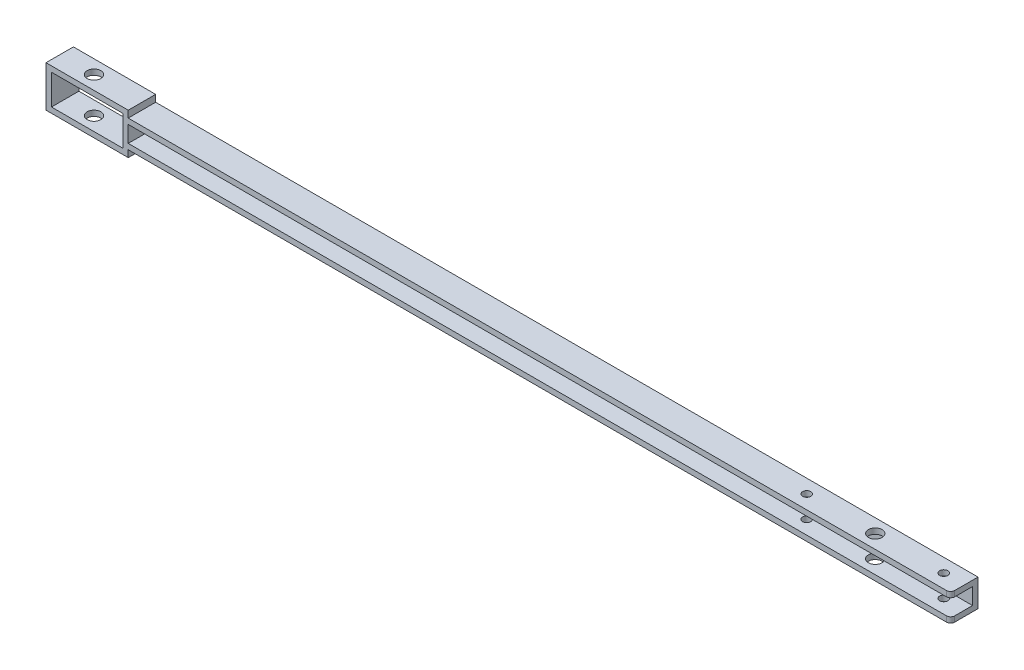
ISO-10303-21;
HEADER;
FILE_DESCRIPTION(('STEP AP214'),'2;1');
FILE_NAME('part.step','',(''),(''),'','','');
FILE_SCHEMA(('AUTOMOTIVE_DESIGN { 1 0 10303 214 1 1 1 1 }'));
ENDSEC;
DATA;
#1=APPLICATION_CONTEXT('core data for automotive mechanical design processes');
#2=APPLICATION_PROTOCOL_DEFINITION('international standard','automotive_design',2000,#1);
#3=PRODUCT_CONTEXT('',#1,'mechanical');
#4=PRODUCT('Part','Part','',(#3));
#5=PRODUCT_RELATED_PRODUCT_CATEGORY('part','',(#4));
#6=PRODUCT_DEFINITION_FORMATION('','',#4);
#7=PRODUCT_DEFINITION_CONTEXT('part definition',#1,'design');
#8=PRODUCT_DEFINITION('design','',#6,#7);
#9=PRODUCT_DEFINITION_SHAPE('','',#8);
#10=(LENGTH_UNIT() NAMED_UNIT(*) SI_UNIT(.MILLI.,.METRE.));
#11=(NAMED_UNIT(*) PLANE_ANGLE_UNIT() SI_UNIT($,.RADIAN.));
#12=(NAMED_UNIT(*) SI_UNIT($,.STERADIAN.) SOLID_ANGLE_UNIT());
#13=UNCERTAINTY_MEASURE_WITH_UNIT(LENGTH_MEASURE(1.E-05),#10,'distance_accuracy_value','');
#14=(GEOMETRIC_REPRESENTATION_CONTEXT(3) GLOBAL_UNCERTAINTY_ASSIGNED_CONTEXT((#13)) GLOBAL_UNIT_ASSIGNED_CONTEXT((#10,
#11,#12)) REPRESENTATION_CONTEXT('',''));
#15=CARTESIAN_POINT('',(0.,0.,0.));
#16=DIRECTION('',(0.,0.,1.));
#17=DIRECTION('',(1.,0.,0.));
#18=AXIS2_PLACEMENT_3D('',#15,#16,#17);
#19=CARTESIAN_POINT('',(30.,10.5,2.));
#20=DIRECTION('',(0.,0.,1.));
#21=DIRECTION('',(1.,0.,0.));
#22=AXIS2_PLACEMENT_3D('',#19,#20,#21);
#23=PLANE('',#22);
#24=DIRECTION('',(0.,1.,0.));
#25=VECTOR('',#24,1.);
#26=CARTESIAN_POINT('',(315.774362689869,4.49999999999996,2.));
#27=LINE('',#26,#25);
#28=CARTESIAN_POINT('',(315.774362689869,4.49999999999996,2.));
#29=VERTEX_POINT('',#28);
#30=CARTESIAN_POINT('',(315.774362689869,10.5,2.));
#31=VERTEX_POINT('',#30);
#32=EDGE_CURVE('E48',#29,#31,#27,.T.);
#33=ORIENTED_EDGE('',*,*,#32,.F.);
#34=DIRECTION('',(1.,0.,0.));
#35=VECTOR('',#34,1.);
#36=CARTESIAN_POINT('',(30.,4.49999999999996,2.));
#37=LINE('',#36,#35);
#38=CARTESIAN_POINT('',(330.,4.49999999999996,2.));
#39=VERTEX_POINT('',#38);
#40=EDGE_CURVE('E354',#29,#39,#37,.T.);
#41=ORIENTED_EDGE('',*,*,#40,.T.);
#42=DIRECTION('',(0.,-1.,0.));
#43=VECTOR('',#42,1.);
#44=CARTESIAN_POINT('',(330.,10.5,2.));
#45=LINE('',#44,#43);
#46=CARTESIAN_POINT('',(330.,10.5,2.));
#47=VERTEX_POINT('',#46);
#48=EDGE_CURVE('E357',#47,#39,#45,.T.);
#49=ORIENTED_EDGE('',*,*,#48,.F.);
#50=DIRECTION('',(1.,0.,0.));
#51=VECTOR('',#50,1.);
#52=CARTESIAN_POINT('',(30.,10.5,2.));
#53=LINE('',#52,#51);
#54=EDGE_CURVE('E373',#31,#47,#53,.T.);
#55=ORIENTED_EDGE('',*,*,#54,.F.);
#56=EDGE_LOOP('',(#33,#41,#49,#55));
#57=FACE_BOUND('',#56,.T.);
#58=ADVANCED_FACE('F33',(#57),#23,.T.);
#59=CARTESIAN_POINT('',(56.5472154339974,4.49999999999996,2.));
#60=VERTEX_POINT('',#59);
#61=CARTESIAN_POINT('',(247.456595828834,4.49999999999996,2.));
#62=VERTEX_POINT('',#61);
#63=EDGE_CURVE('E377',#60,#62,#37,.T.);
#64=ORIENTED_EDGE('',*,*,#63,.T.);
#65=DIRECTION('',(0.,1.,0.));
#66=VECTOR('',#65,1.);
#67=CARTESIAN_POINT('',(247.456595828834,0.,2.));
#68=LINE('',#67,#66);
#69=CARTESIAN_POINT('',(247.456595828834,10.5,2.));
#70=VERTEX_POINT('',#69);
#71=EDGE_CURVE('E56',#62,#70,#68,.T.);
#72=ORIENTED_EDGE('',*,*,#71,.T.);
#73=CARTESIAN_POINT('',(56.5472154339974,10.5,2.));
#74=VERTEX_POINT('',#73);
#75=EDGE_CURVE('E372',#74,#70,#53,.T.);
#76=ORIENTED_EDGE('',*,*,#75,.F.);
#77=DIRECTION('',(0.,1.,0.));
#78=VECTOR('',#77,1.);
#79=CARTESIAN_POINT('',(56.5472154339974,10.5,2.));
#80=LINE('',#79,#78);
#81=EDGE_CURVE('E291',#60,#74,#80,.T.);
#82=ORIENTED_EDGE('',*,*,#81,.F.);
#83=EDGE_LOOP('',(#64,#72,#76,#82));
#84=FACE_BOUND('',#83,.T.);
#85=ADVANCED_FACE('F579',(#84),#23,.T.);
#86=DIRECTION('',(0.,-1.,0.));
#87=VECTOR('',#86,1.);
#88=CARTESIAN_POINT('',(41.5472154339974,10.5,2.));
#89=LINE('',#88,#87);
#90=CARTESIAN_POINT('',(41.5472154339974,10.5,2.));
#91=VERTEX_POINT('',#90);
#92=CARTESIAN_POINT('',(41.5472154339974,4.49999999999996,2.));
#93=VERTEX_POINT('',#92);
#94=EDGE_CURVE('E281',#91,#93,#89,.T.);
#95=ORIENTED_EDGE('',*,*,#94,.F.);
#96=CARTESIAN_POINT('',(30.,10.5,2.));
#97=VERTEX_POINT('',#96);
#98=EDGE_CURVE('E369',#97,#91,#53,.T.);
#99=ORIENTED_EDGE('',*,*,#98,.F.);
#100=DIRECTION('',(0.,-1.,0.));
#101=VECTOR('',#100,1.);
#102=CARTESIAN_POINT('',(30.,10.5,2.));
#103=LINE('',#102,#101);
#104=CARTESIAN_POINT('',(30.,4.49999999999996,2.));
#105=VERTEX_POINT('',#104);
#106=EDGE_CURVE('E346',#97,#105,#103,.T.);
#107=ORIENTED_EDGE('',*,*,#106,.T.);
#108=EDGE_CURVE('E374',#105,#93,#37,.T.);
#109=ORIENTED_EDGE('',*,*,#108,.T.);
#110=EDGE_LOOP('',(#95,#99,#107,#109));
#111=FACE_BOUND('',#110,.T.);
#112=ADVANCED_FACE('F561',(#111),#23,.T.);
#113=CARTESIAN_POINT('',(30.,0.,10.));
#114=DIRECTION('',(-1.,0.,0.));
#115=DIRECTION('',(0.,0.,1.));
#116=AXIS2_PLACEMENT_3D('',#113,#114,#115);
#117=PLANE('',#116);
#118=DIRECTION('',(0.,0.,-1.));
#119=VECTOR('',#118,1.);
#120=CARTESIAN_POINT('',(30.,2.5,10.));
#121=LINE('',#120,#119);
#122=CARTESIAN_POINT('',(30.,2.5,10.));
#123=VERTEX_POINT('',#122);
#124=CARTESIAN_POINT('',(30.,2.5,0.));
#125=VERTEX_POINT('',#124);
#126=EDGE_CURVE('E392',#123,#125,#121,.T.);
#127=ORIENTED_EDGE('',*,*,#126,.F.);
#128=DIRECTION('',(0.,1.,0.));
#129=VECTOR('',#128,1.);
#130=CARTESIAN_POINT('',(30.,0.,10.));
#131=LINE('',#130,#129);
#132=CARTESIAN_POINT('',(30.,0.,10.));
#133=VERTEX_POINT('',#132);
#134=EDGE_CURVE('E449',#133,#123,#131,.T.);
#135=ORIENTED_EDGE('',*,*,#134,.F.);
#136=DIRECTION('',(0.,0.,-1.));
#137=VECTOR('',#136,1.);
#138=CARTESIAN_POINT('',(30.,0.,10.));
#139=LINE('',#138,#137);
#140=CARTESIAN_POINT('',(30.,0.,0.));
#141=VERTEX_POINT('',#140);
#142=EDGE_CURVE('E469',#133,#141,#139,.T.);
#143=ORIENTED_EDGE('',*,*,#142,.T.);
#144=DIRECTION('',(0.,1.,0.));
#145=VECTOR('',#144,1.);
#146=CARTESIAN_POINT('',(30.,0.,0.));
#147=LINE('',#146,#145);
#148=EDGE_CURVE('E460',#141,#125,#147,.T.);
#149=ORIENTED_EDGE('',*,*,#148,.T.);
#150=EDGE_LOOP('',(#127,#135,#143,#149));
#151=FACE_BOUND('',#150,.T.);
#152=ADVANCED_FACE('F542',(#151),#117,.F.);
#153=CARTESIAN_POINT('',(0.,0.,10.));
#154=DIRECTION('',(0.,0.,-1.));
#155=DIRECTION('',(-1.,0.,0.));
#156=AXIS2_PLACEMENT_3D('',#153,#154,#155);
#157=PLANE('',#156);
#158=DIRECTION('',(-1.,0.,0.));
#159=VECTOR('',#158,1.);
#160=CARTESIAN_POINT('',(30.,2.5,10.));
#161=LINE('',#160,#159);
#162=CARTESIAN_POINT('',(328.5,2.49999999999996,10.));
#163=VERTEX_POINT('',#162);
#164=EDGE_CURVE('E381',#163,#123,#161,.T.);
#165=ORIENTED_EDGE('',*,*,#164,.F.);
#166=DIRECTION('',(0.,-1.,0.));
#167=VECTOR('',#166,1.);
#168=CARTESIAN_POINT('',(328.5,4.49999999999996,10.));
#169=LINE('',#168,#167);
#170=CARTESIAN_POINT('',(328.5,4.49999999999996,10.));
#171=VERTEX_POINT('',#170);
#172=EDGE_CURVE('E493',#163,#171,#169,.F.);
#173=ORIENTED_EDGE('',*,*,#172,.T.);
#174=DIRECTION('',(1.,0.,0.));
#175=VECTOR('',#174,1.);
#176=CARTESIAN_POINT('',(30.,4.49999999999996,10.));
#177=LINE('',#176,#175);
#178=CARTESIAN_POINT('',(30.,4.49999999999996,10.));
#179=VERTEX_POINT('',#178);
#180=EDGE_CURVE('E362',#179,#171,#177,.T.);
#181=ORIENTED_EDGE('',*,*,#180,.F.);
#182=DIRECTION('',(0.,-1.,0.));
#183=VECTOR('',#182,1.);
#184=CARTESIAN_POINT('',(30.,10.5,10.));
#185=LINE('',#184,#183);
#186=CARTESIAN_POINT('',(30.,10.5,10.));
#187=VERTEX_POINT('',#186);
#188=EDGE_CURVE('E351',#187,#179,#185,.T.);
#189=ORIENTED_EDGE('',*,*,#188,.F.);
#190=DIRECTION('',(1.,0.,0.));
#191=VECTOR('',#190,1.);
#192=CARTESIAN_POINT('',(30.,10.5,10.));
#193=LINE('',#192,#191);
#194=CARTESIAN_POINT('',(328.5,10.5,10.));
#195=VERTEX_POINT('',#194);
#196=EDGE_CURVE('E366',#187,#195,#193,.T.);
#197=ORIENTED_EDGE('',*,*,#196,.T.);
#198=DIRECTION('',(0.,-1.,0.));
#199=VECTOR('',#198,1.);
#200=CARTESIAN_POINT('',(328.5,12.5,10.));
#201=LINE('',#200,#199);
#202=CARTESIAN_POINT('',(328.5,12.5,10.));
#203=VERTEX_POINT('',#202);
#204=EDGE_CURVE('E491',#195,#203,#201,.F.);
#205=ORIENTED_EDGE('',*,*,#204,.T.);
#206=DIRECTION('',(1.,0.,0.));
#207=VECTOR('',#206,1.);
#208=CARTESIAN_POINT('',(30.,12.5,10.));
#209=LINE('',#208,#207);
#210=CARTESIAN_POINT('',(30.,12.5,10.));
#211=VERTEX_POINT('',#210);
#212=EDGE_CURVE('E378',#211,#203,#209,.T.);
#213=ORIENTED_EDGE('',*,*,#212,.F.);
#214=CARTESIAN_POINT('',(30.,15.,10.));
#215=VERTEX_POINT('',#214);
#216=EDGE_CURVE('E448',#211,#215,#131,.T.);
#217=ORIENTED_EDGE('',*,*,#216,.T.);
#218=DIRECTION('',(-1.,0.,0.));
#219=VECTOR('',#218,1.);
#220=CARTESIAN_POINT('',(0.,15.,10.));
#221=LINE('',#220,#219);
#222=CARTESIAN_POINT('',(0.,15.,10.));
#223=VERTEX_POINT('',#222);
#224=EDGE_CURVE('E452',#215,#223,#221,.T.);
#225=ORIENTED_EDGE('',*,*,#224,.T.);
#226=DIRECTION('',(0.,-1.,0.));
#227=VECTOR('',#226,1.);
#228=CARTESIAN_POINT('',(0.,0.,10.));
#229=LINE('',#228,#227);
#230=CARTESIAN_POINT('',(0.,0.,10.));
#231=VERTEX_POINT('',#230);
#232=EDGE_CURVE('E442',#223,#231,#229,.T.);
#233=ORIENTED_EDGE('',*,*,#232,.T.);
#234=DIRECTION('',(1.,0.,0.));
#235=VECTOR('',#234,1.);
#236=CARTESIAN_POINT('',(0.,0.,10.));
#237=LINE('',#236,#235);
#238=EDGE_CURVE('E445',#231,#133,#237,.T.);
#239=ORIENTED_EDGE('',*,*,#238,.T.);
#240=ORIENTED_EDGE('',*,*,#134,.T.);
#241=EDGE_LOOP('',(#165,#173,#181,#189,#197,#205,#213,#217,#225,#233,#239,#240));
#242=FACE_BOUND('',#241,.T.);
#243=DIRECTION('',(0.,-1.,0.));
#244=VECTOR('',#243,1.);
#245=CARTESIAN_POINT('',(2.,13.,10.));
#246=LINE('',#245,#244);
#247=CARTESIAN_POINT('',(2.,13.,10.));
#248=VERTEX_POINT('',#247);
#249=CARTESIAN_POINT('',(2.,2.,10.));
#250=VERTEX_POINT('',#249);
#251=EDGE_CURVE('E411',#248,#250,#246,.T.);
#252=ORIENTED_EDGE('',*,*,#251,.F.);
#253=DIRECTION('',(-1.,0.,0.));
#254=VECTOR('',#253,1.);
#255=CARTESIAN_POINT('',(2.,13.,10.));
#256=LINE('',#255,#254);
#257=CARTESIAN_POINT('',(28.,13.,10.));
#258=VERTEX_POINT('',#257);
#259=EDGE_CURVE('E419',#258,#248,#256,.T.);
#260=ORIENTED_EDGE('',*,*,#259,.F.);
#261=DIRECTION('',(0.,1.,0.));
#262=VECTOR('',#261,1.);
#263=CARTESIAN_POINT('',(28.,13.,10.));
#264=LINE('',#263,#262);
#265=CARTESIAN_POINT('',(28.,2.,10.));
#266=VERTEX_POINT('',#265);
#267=EDGE_CURVE('E416',#266,#258,#264,.T.);
#268=ORIENTED_EDGE('',*,*,#267,.F.);
#269=DIRECTION('',(1.,0.,0.));
#270=VECTOR('',#269,1.);
#271=CARTESIAN_POINT('',(2.,2.,10.));
#272=LINE('',#271,#270);
#273=EDGE_CURVE('E413',#250,#266,#272,.T.);
#274=ORIENTED_EDGE('',*,*,#273,.F.);
#275=EDGE_LOOP('',(#252,#260,#268,#274));
#276=FACE_BOUND('',#275,.T.);
#277=ADVANCED_FACE('F503',(#242,#276),#157,.F.);
#278=CARTESIAN_POINT('',(0.,0.,0.));
#279=DIRECTION('',(0.,0.,-1.));
#280=DIRECTION('',(-1.,0.,0.));
#281=AXIS2_PLACEMENT_3D('',#278,#279,#280);
#282=PLANE('',#281);
#283=DIRECTION('',(0.,-1.,0.));
#284=VECTOR('',#283,1.);
#285=CARTESIAN_POINT('',(0.,0.,0.));
#286=LINE('',#285,#284);
#287=CARTESIAN_POINT('',(0.,15.,0.));
#288=VERTEX_POINT('',#287);
#289=CARTESIAN_POINT('',(0.,0.,0.));
#290=VERTEX_POINT('',#289);
#291=EDGE_CURVE('E441',#288,#290,#286,.T.);
#292=ORIENTED_EDGE('',*,*,#291,.F.);
#293=DIRECTION('',(-1.,0.,0.));
#294=VECTOR('',#293,1.);
#295=CARTESIAN_POINT('',(0.,15.,0.));
#296=LINE('',#295,#294);
#297=CARTESIAN_POINT('',(30.,15.,0.));
#298=VERTEX_POINT('',#297);
#299=EDGE_CURVE('E446',#298,#288,#296,.T.);
#300=ORIENTED_EDGE('',*,*,#299,.F.);
#301=CARTESIAN_POINT('',(30.,12.5,0.));
#302=VERTEX_POINT('',#301);
#303=EDGE_CURVE('E459',#302,#298,#147,.T.);
#304=ORIENTED_EDGE('',*,*,#303,.F.);
#305=DIRECTION('',(1.,0.,0.));
#306=VECTOR('',#305,1.);
#307=CARTESIAN_POINT('',(30.,12.5,0.));
#308=LINE('',#307,#306);
#309=CARTESIAN_POINT('',(330.,12.5,0.));
#310=VERTEX_POINT('',#309);
#311=EDGE_CURVE('E365',#302,#310,#308,.T.);
#312=ORIENTED_EDGE('',*,*,#311,.T.);
#313=DIRECTION('',(0.,-1.,0.));
#314=VECTOR('',#313,1.);
#315=CARTESIAN_POINT('',(330.,12.5,0.));
#316=LINE('',#315,#314);
#317=CARTESIAN_POINT('',(330.,2.49999999999996,0.));
#318=VERTEX_POINT('',#317);
#319=EDGE_CURVE('E387',#310,#318,#316,.T.);
#320=ORIENTED_EDGE('',*,*,#319,.T.);
#321=DIRECTION('',(-1.,0.,0.));
#322=VECTOR('',#321,1.);
#323=CARTESIAN_POINT('',(30.,2.5,0.));
#324=LINE('',#323,#322);
#325=EDGE_CURVE('E382',#318,#125,#324,.T.);
#326=ORIENTED_EDGE('',*,*,#325,.T.);
#327=ORIENTED_EDGE('',*,*,#148,.F.);
#328=DIRECTION('',(1.,0.,0.));
#329=VECTOR('',#328,1.);
#330=CARTESIAN_POINT('',(0.,0.,0.));
#331=LINE('',#330,#329);
#332=EDGE_CURVE('E457',#290,#141,#331,.T.);
#333=ORIENTED_EDGE('',*,*,#332,.F.);
#334=EDGE_LOOP('',(#292,#300,#304,#312,#320,#326,#327,#333));
#335=FACE_BOUND('',#334,.T.);
#336=DIRECTION('',(-1.,0.,0.));
#337=VECTOR('',#336,1.);
#338=CARTESIAN_POINT('',(2.,13.,0.));
#339=LINE('',#338,#337);
#340=CARTESIAN_POINT('',(28.,13.,0.));
#341=VERTEX_POINT('',#340);
#342=CARTESIAN_POINT('',(2.,13.,0.));
#343=VERTEX_POINT('',#342);
#344=EDGE_CURVE('E414',#341,#343,#339,.T.);
#345=ORIENTED_EDGE('',*,*,#344,.T.);
#346=DIRECTION('',(0.,-1.,0.));
#347=VECTOR('',#346,1.);
#348=CARTESIAN_POINT('',(2.,13.,0.));
#349=LINE('',#348,#347);
#350=CARTESIAN_POINT('',(2.,2.,0.));
#351=VERTEX_POINT('',#350);
#352=EDGE_CURVE('E410',#343,#351,#349,.T.);
#353=ORIENTED_EDGE('',*,*,#352,.T.);
#354=DIRECTION('',(1.,0.,0.));
#355=VECTOR('',#354,1.);
#356=CARTESIAN_POINT('',(2.,2.,0.));
#357=LINE('',#356,#355);
#358=CARTESIAN_POINT('',(28.,2.,0.));
#359=VERTEX_POINT('',#358);
#360=EDGE_CURVE('E424',#351,#359,#357,.T.);
#361=ORIENTED_EDGE('',*,*,#360,.T.);
#362=DIRECTION('',(0.,1.,0.));
#363=VECTOR('',#362,1.);
#364=CARTESIAN_POINT('',(28.,13.,0.));
#365=LINE('',#364,#363);
#366=EDGE_CURVE('E427',#359,#341,#365,.T.);
#367=ORIENTED_EDGE('',*,*,#366,.T.);
#368=EDGE_LOOP('',(#345,#353,#361,#367));
#369=FACE_BOUND('',#368,.T.);
#370=ADVANCED_FACE('F520',(#335,#369),#282,.T.);
#371=CARTESIAN_POINT('',(0.,0.,10.));
#372=DIRECTION('',(1.,0.,0.));
#373=DIRECTION('',(0.,0.,-1.));
#374=AXIS2_PLACEMENT_3D('',#371,#372,#373);
#375=PLANE('',#374);
#376=ORIENTED_EDGE('',*,*,#291,.T.);
#377=DIRECTION('',(0.,0.,-1.));
#378=VECTOR('',#377,1.);
#379=CARTESIAN_POINT('',(0.,0.,10.));
#380=LINE('',#379,#378);
#381=EDGE_CURVE('E472',#231,#290,#380,.T.);
#382=ORIENTED_EDGE('',*,*,#381,.F.);
#383=ORIENTED_EDGE('',*,*,#232,.F.);
#384=DIRECTION('',(0.,0.,-1.));
#385=VECTOR('',#384,1.);
#386=CARTESIAN_POINT('',(0.,15.,10.));
#387=LINE('',#386,#385);
#388=EDGE_CURVE('E454',#223,#288,#387,.T.);
#389=ORIENTED_EDGE('',*,*,#388,.T.);
#390=EDGE_LOOP('',(#376,#382,#383,#389));
#391=FACE_BOUND('',#390,.T.);
#392=ADVANCED_FACE('F534',(#391),#375,.F.);
#393=CARTESIAN_POINT('',(0.,0.,10.));
#394=DIRECTION('',(0.,1.,0.));
#395=DIRECTION('',(0.,0.,1.));
#396=AXIS2_PLACEMENT_3D('',#393,#394,#395);
#397=PLANE('',#396);
#398=CARTESIAN_POINT('',(12.5,0.,5.));
#399=DIRECTION('',(0.,1.,0.));
#400=DIRECTION('',(0.,0.,1.));
#401=AXIS2_PLACEMENT_3D('',#398,#399,#400);
#402=CIRCLE('',#401,2.5);
#403=CARTESIAN_POINT('',(12.5,0.,7.5));
#404=VERTEX_POINT('',#403);
#405=EDGE_CURVE('E407',#404,#404,#402,.T.);
#406=ORIENTED_EDGE('',*,*,#405,.T.);
#407=EDGE_LOOP('',(#406));
#408=FACE_BOUND('',#407,.T.);
#409=ORIENTED_EDGE('',*,*,#332,.T.);
#410=ORIENTED_EDGE('',*,*,#142,.F.);
#411=ORIENTED_EDGE('',*,*,#238,.F.);
#412=ORIENTED_EDGE('',*,*,#381,.T.);
#413=EDGE_LOOP('',(#409,#410,#411,#412));
#414=FACE_BOUND('',#413,.T.);
#415=ADVANCED_FACE('F536',(#408,#414),#397,.F.);
#416=ORIENTED_EDGE('',*,*,#216,.F.);
#417=DIRECTION('',(0.,0.,-1.));
#418=VECTOR('',#417,1.);
#419=CARTESIAN_POINT('',(30.,12.5,10.));
#420=LINE('',#419,#418);
#421=EDGE_CURVE('E384',#211,#302,#420,.T.);
#422=ORIENTED_EDGE('',*,*,#421,.T.);
#423=ORIENTED_EDGE('',*,*,#303,.T.);
#424=DIRECTION('',(0.,0.,-1.));
#425=VECTOR('',#424,1.);
#426=CARTESIAN_POINT('',(30.,15.,10.));
#427=LINE('',#426,#425);
#428=EDGE_CURVE('E466',#215,#298,#427,.T.);
#429=ORIENTED_EDGE('',*,*,#428,.F.);
#430=EDGE_LOOP('',(#416,#422,#423,#429));
#431=FACE_BOUND('',#430,.T.);
#432=ADVANCED_FACE('F525',(#431),#117,.F.);
#433=CARTESIAN_POINT('',(0.,15.,10.));
#434=DIRECTION('',(0.,-1.,0.));
#435=DIRECTION('',(0.,0.,-1.));
#436=AXIS2_PLACEMENT_3D('',#433,#434,#435);
#437=PLANE('',#436);
#438=CARTESIAN_POINT('',(12.5,15.,5.));
#439=DIRECTION('',(0.,1.,0.));
#440=DIRECTION('',(0.,0.,1.));
#441=AXIS2_PLACEMENT_3D('',#438,#439,#440);
#442=CIRCLE('',#441,2.5);
#443=CARTESIAN_POINT('',(12.5,15.,7.5));
#444=VERTEX_POINT('',#443);
#445=EDGE_CURVE('E394',#444,#444,#442,.T.);
#446=ORIENTED_EDGE('',*,*,#445,.F.);
#447=EDGE_LOOP('',(#446));
#448=FACE_BOUND('',#447,.T.);
#449=ORIENTED_EDGE('',*,*,#299,.T.);
#450=ORIENTED_EDGE('',*,*,#388,.F.);
#451=ORIENTED_EDGE('',*,*,#224,.F.);
#452=ORIENTED_EDGE('',*,*,#428,.T.);
#453=EDGE_LOOP('',(#449,#450,#451,#452));
#454=FACE_BOUND('',#453,.T.);
#455=ADVANCED_FACE('F532',(#448,#454),#437,.F.);
#456=CARTESIAN_POINT('',(2.,13.,10.));
#457=DIRECTION('',(1.,0.,0.));
#458=DIRECTION('',(0.,1.,0.));
#459=AXIS2_PLACEMENT_3D('',#456,#457,#458);
#460=PLANE('',#459);
#461=ORIENTED_EDGE('',*,*,#352,.F.);
#462=DIRECTION('',(0.,0.,-1.));
#463=VECTOR('',#462,1.);
#464=CARTESIAN_POINT('',(2.,13.,10.));
#465=LINE('',#464,#463);
#466=EDGE_CURVE('E421',#248,#343,#465,.T.);
#467=ORIENTED_EDGE('',*,*,#466,.F.);
#468=ORIENTED_EDGE('',*,*,#251,.T.);
#469=DIRECTION('',(0.,0.,-1.));
#470=VECTOR('',#469,1.);
#471=CARTESIAN_POINT('',(2.,2.,10.));
#472=LINE('',#471,#470);
#473=EDGE_CURVE('E438',#250,#351,#472,.T.);
#474=ORIENTED_EDGE('',*,*,#473,.T.);
#475=EDGE_LOOP('',(#461,#467,#468,#474));
#476=FACE_BOUND('',#475,.T.);
#477=ADVANCED_FACE('F646',(#476),#460,.T.);
#478=CARTESIAN_POINT('',(2.,2.,10.));
#479=DIRECTION('',(0.,1.,0.));
#480=DIRECTION('',(0.,0.,1.));
#481=AXIS2_PLACEMENT_3D('',#478,#479,#480);
#482=PLANE('',#481);
#483=CARTESIAN_POINT('',(12.5,2.,5.));
#484=DIRECTION('',(0.,1.,0.));
#485=DIRECTION('',(0.,0.,1.));
#486=AXIS2_PLACEMENT_3D('',#483,#484,#485);
#487=CIRCLE('',#486,2.5);
#488=CARTESIAN_POINT('',(12.5,2.,7.5));
#489=VERTEX_POINT('',#488);
#490=EDGE_CURVE('E404',#489,#489,#487,.T.);
#491=ORIENTED_EDGE('',*,*,#490,.F.);
#492=EDGE_LOOP('',(#491));
#493=FACE_BOUND('',#492,.T.);
#494=ORIENTED_EDGE('',*,*,#360,.F.);
#495=ORIENTED_EDGE('',*,*,#473,.F.);
#496=ORIENTED_EDGE('',*,*,#273,.T.);
#497=DIRECTION('',(0.,0.,-1.));
#498=VECTOR('',#497,1.);
#499=CARTESIAN_POINT('',(28.,2.,10.));
#500=LINE('',#499,#498);
#501=EDGE_CURVE('E436',#266,#359,#500,.T.);
#502=ORIENTED_EDGE('',*,*,#501,.T.);
#503=EDGE_LOOP('',(#494,#495,#496,#502));
#504=FACE_BOUND('',#503,.T.);
#505=ADVANCED_FACE('F719',(#493,#504),#482,.T.);
#506=CARTESIAN_POINT('',(28.,13.,10.));
#507=DIRECTION('',(-1.,0.,0.));
#508=DIRECTION('',(0.,0.,1.));
#509=AXIS2_PLACEMENT_3D('',#506,#507,#508);
#510=PLANE('',#509);
#511=ORIENTED_EDGE('',*,*,#366,.F.);
#512=ORIENTED_EDGE('',*,*,#501,.F.);
#513=ORIENTED_EDGE('',*,*,#267,.T.);
#514=DIRECTION('',(0.,0.,-1.));
#515=VECTOR('',#514,1.);
#516=CARTESIAN_POINT('',(28.,13.,10.));
#517=LINE('',#516,#515);
#518=EDGE_CURVE('E434',#258,#341,#517,.T.);
#519=ORIENTED_EDGE('',*,*,#518,.T.);
#520=EDGE_LOOP('',(#511,#512,#513,#519));
#521=FACE_BOUND('',#520,.T.);
#522=ADVANCED_FACE('F715',(#521),#510,.T.);
#523=CARTESIAN_POINT('',(2.,13.,10.));
#524=DIRECTION('',(0.,-1.,0.));
#525=DIRECTION('',(0.,0.,-1.));
#526=AXIS2_PLACEMENT_3D('',#523,#524,#525);
#527=PLANE('',#526);
#528=CARTESIAN_POINT('',(12.5,13.,5.));
#529=DIRECTION('',(0.,-1.,0.));
#530=DIRECTION('',(0.,0.,-1.));
#531=AXIS2_PLACEMENT_3D('',#528,#529,#530);
#532=CIRCLE('',#531,2.5);
#533=CARTESIAN_POINT('',(12.5,13.,2.5));
#534=VERTEX_POINT('',#533);
#535=EDGE_CURVE('E403',#534,#534,#532,.T.);
#536=ORIENTED_EDGE('',*,*,#535,.F.);
#537=EDGE_LOOP('',(#536));
#538=FACE_BOUND('',#537,.T.);
#539=ORIENTED_EDGE('',*,*,#344,.F.);
#540=ORIENTED_EDGE('',*,*,#518,.F.);
#541=ORIENTED_EDGE('',*,*,#259,.T.);
#542=ORIENTED_EDGE('',*,*,#466,.T.);
#543=EDGE_LOOP('',(#539,#540,#541,#542));
#544=FACE_BOUND('',#543,.T.);
#545=ADVANCED_FACE('F711',(#538,#544),#527,.T.);
#546=CARTESIAN_POINT('',(12.5,-85.,5.));
#547=DIRECTION('',(0.,1.,0.));
#548=DIRECTION('',(0.,0.,1.));
#549=AXIS2_PLACEMENT_3D('',#546,#547,#548);
#550=CYLINDRICAL_SURFACE('',#549,2.5);
#551=ORIENTED_EDGE('',*,*,#535,.T.);
#552=EDGE_LOOP('',(#551));
#553=FACE_BOUND('',#552,.T.);
#554=ORIENTED_EDGE('',*,*,#445,.T.);
#555=EDGE_LOOP('',(#554));
#556=FACE_BOUND('',#555,.T.);
#557=ADVANCED_FACE('F707',(#553,#556),#550,.F.);
#558=ORIENTED_EDGE('',*,*,#490,.T.);
#559=EDGE_LOOP('',(#558));
#560=FACE_BOUND('',#559,.T.);
#561=ORIENTED_EDGE('',*,*,#405,.F.);
#562=EDGE_LOOP('',(#561));
#563=FACE_BOUND('',#562,.T.);
#564=ADVANCED_FACE('F710',(#560,#563),#550,.F.);
#565=CARTESIAN_POINT('',(30.,2.5,10.));
#566=DIRECTION('',(0.,-1.,0.));
#567=DIRECTION('',(1.,0.,0.));
#568=AXIS2_PLACEMENT_3D('',#565,#566,#567);
#569=PLANE('',#568);
#570=CARTESIAN_POINT('',(272.5,2.49999999999997,5.));
#571=DIRECTION('',(0.,-1.,0.));
#572=DIRECTION('',(1.,0.,0.));
#573=AXIS2_PLACEMENT_3D('',#570,#571,#572);
#574=CIRCLE('',#573,1.50000000000002);
#575=CARTESIAN_POINT('',(274.,2.49999999999997,5.));
#576=VERTEX_POINT('',#575);
#577=EDGE_CURVE('E313',#576,#576,#574,.T.);
#578=ORIENTED_EDGE('',*,*,#577,.F.);
#579=EDGE_LOOP('',(#578));
#580=FACE_BOUND('',#579,.T.);
#581=CARTESIAN_POINT('',(297.5,2.49999999999997,5.));
#582=DIRECTION('',(0.,-1.,0.));
#583=DIRECTION('',(1.,0.,0.));
#584=AXIS2_PLACEMENT_3D('',#581,#582,#583);
#585=CIRCLE('',#584,2.50000000000002);
#586=CARTESIAN_POINT('',(300.,2.49999999999997,5.));
#587=VERTEX_POINT('',#586);
#588=EDGE_CURVE('E317',#587,#587,#585,.T.);
#589=ORIENTED_EDGE('',*,*,#588,.F.);
#590=EDGE_LOOP('',(#589));
#591=FACE_BOUND('',#590,.T.);
#592=CARTESIAN_POINT('',(322.5,2.49999999999996,5.));
#593=DIRECTION('',(0.,-1.,0.));
#594=DIRECTION('',(1.,0.,0.));
#595=AXIS2_PLACEMENT_3D('',#592,#593,#594);
#596=CIRCLE('',#595,1.50000000000002);
#597=CARTESIAN_POINT('',(324.,2.49999999999996,5.));
#598=VERTEX_POINT('',#597);
#599=EDGE_CURVE('E306',#598,#598,#596,.T.);
#600=ORIENTED_EDGE('',*,*,#599,.F.);
#601=EDGE_LOOP('',(#600));
#602=FACE_BOUND('',#601,.T.);
#603=DIRECTION('',(0.,0.,-1.));
#604=VECTOR('',#603,1.);
#605=CARTESIAN_POINT('',(330.,2.49999999999996,10.));
#606=LINE('',#605,#604);
#607=CARTESIAN_POINT('',(330.,2.49999999999996,8.5));
#608=VERTEX_POINT('',#607);
#609=EDGE_CURVE('E395',#608,#318,#606,.T.);
#610=ORIENTED_EDGE('',*,*,#609,.F.);
#611=CARTESIAN_POINT('',(328.5,2.49999999999996,8.5));
#612=DIRECTION('',(0.,-1.,0.));
#613=DIRECTION('',(1.,0.,0.));
#614=AXIS2_PLACEMENT_3D('',#611,#612,#613);
#615=CIRCLE('',#614,1.5);
#616=EDGE_CURVE('E489',#608,#163,#615,.T.);
#617=ORIENTED_EDGE('',*,*,#616,.T.);
#618=ORIENTED_EDGE('',*,*,#164,.T.);
#619=ORIENTED_EDGE('',*,*,#126,.T.);
#620=ORIENTED_EDGE('',*,*,#325,.F.);
#621=EDGE_LOOP('',(#610,#617,#618,#619,#620));
#622=FACE_BOUND('',#621,.T.);
#623=ADVANCED_FACE('F545',(#580,#591,#602,#622),#569,.T.);
#624=CARTESIAN_POINT('',(330.,12.5,10.));
#625=DIRECTION('',(1.,0.,0.));
#626=DIRECTION('',(0.,0.,-1.));
#627=AXIS2_PLACEMENT_3D('',#624,#625,#626);
#628=PLANE('',#627);
#629=DIRECTION('',(0.,0.,-1.));
#630=VECTOR('',#629,1.);
#631=CARTESIAN_POINT('',(330.,4.49999999999996,10.));
#632=LINE('',#631,#630);
#633=CARTESIAN_POINT('',(330.,4.49999999999996,8.5));
#634=VERTEX_POINT('',#633);
#635=EDGE_CURVE('E342',#634,#39,#632,.T.);
#636=ORIENTED_EDGE('',*,*,#635,.F.);
#637=DIRECTION('',(0.,-1.,0.));
#638=VECTOR('',#637,1.);
#639=CARTESIAN_POINT('',(330.,2.49999999999996,8.5));
#640=LINE('',#639,#638);
#641=EDGE_CURVE('E486',#634,#608,#640,.T.);
#642=ORIENTED_EDGE('',*,*,#641,.T.);
#643=ORIENTED_EDGE('',*,*,#609,.T.);
#644=ORIENTED_EDGE('',*,*,#319,.F.);
#645=DIRECTION('',(0.,0.,-1.));
#646=VECTOR('',#645,1.);
#647=CARTESIAN_POINT('',(330.,12.5,10.));
#648=LINE('',#647,#646);
#649=CARTESIAN_POINT('',(330.,12.5,8.5));
#650=VERTEX_POINT('',#649);
#651=EDGE_CURVE('E397',#650,#310,#648,.T.);
#652=ORIENTED_EDGE('',*,*,#651,.F.);
#653=DIRECTION('',(0.,-1.,0.));
#654=VECTOR('',#653,1.);
#655=CARTESIAN_POINT('',(330.,10.5,8.5));
#656=LINE('',#655,#654);
#657=CARTESIAN_POINT('',(330.,10.5,8.5));
#658=VERTEX_POINT('',#657);
#659=EDGE_CURVE('E475',#650,#658,#656,.T.);
#660=ORIENTED_EDGE('',*,*,#659,.T.);
#661=DIRECTION('',(0.,0.,-1.));
#662=VECTOR('',#661,1.);
#663=CARTESIAN_POINT('',(330.,10.5,10.));
#664=LINE('',#663,#662);
#665=EDGE_CURVE('E347',#658,#47,#664,.T.);
#666=ORIENTED_EDGE('',*,*,#665,.T.);
#667=ORIENTED_EDGE('',*,*,#48,.T.);
#668=EDGE_LOOP('',(#636,#642,#643,#644,#652,#660,#666,#667));
#669=FACE_BOUND('',#668,.T.);
#670=ADVANCED_FACE('F514',(#669),#628,.T.);
#671=CARTESIAN_POINT('',(30.,12.5,10.));
#672=DIRECTION('',(0.,1.,0.));
#673=DIRECTION('',(-1.,0.,0.));
#674=AXIS2_PLACEMENT_3D('',#671,#672,#673);
#675=PLANE('',#674);
#676=CARTESIAN_POINT('',(272.5,12.5,5.));
#677=DIRECTION('',(0.,1.,0.));
#678=DIRECTION('',(-1.,0.,0.));
#679=AXIS2_PLACEMENT_3D('',#676,#677,#678);
#680=CIRCLE('',#679,1.50000000000002);
#681=CARTESIAN_POINT('',(271.,12.5,5.));
#682=VERTEX_POINT('',#681);
#683=EDGE_CURVE('E339',#682,#682,#680,.T.);
#684=ORIENTED_EDGE('',*,*,#683,.F.);
#685=EDGE_LOOP('',(#684));
#686=FACE_BOUND('',#685,.T.);
#687=CARTESIAN_POINT('',(297.5,12.5,5.));
#688=DIRECTION('',(0.,1.,0.));
#689=DIRECTION('',(-1.,0.,0.));
#690=AXIS2_PLACEMENT_3D('',#687,#688,#689);
#691=CIRCLE('',#690,2.50000000000002);
#692=CARTESIAN_POINT('',(295.,12.5,5.));
#693=VERTEX_POINT('',#692);
#694=EDGE_CURVE('E332',#693,#693,#691,.T.);
#695=ORIENTED_EDGE('',*,*,#694,.F.);
#696=EDGE_LOOP('',(#695));
#697=FACE_BOUND('',#696,.T.);
#698=CARTESIAN_POINT('',(322.5,12.5,5.));
#699=DIRECTION('',(0.,1.,0.));
#700=DIRECTION('',(-1.,0.,0.));
#701=AXIS2_PLACEMENT_3D('',#698,#699,#700);
#702=CIRCLE('',#701,1.50000000000002);
#703=CARTESIAN_POINT('',(321.,12.5,5.));
#704=VERTEX_POINT('',#703);
#705=EDGE_CURVE('E325',#704,#704,#702,.T.);
#706=ORIENTED_EDGE('',*,*,#705,.F.);
#707=EDGE_LOOP('',(#706));
#708=FACE_BOUND('',#707,.T.);
#709=ORIENTED_EDGE('',*,*,#212,.T.);
#710=CARTESIAN_POINT('',(328.5,12.5,8.5));
#711=DIRECTION('',(0.,1.,0.));
#712=DIRECTION('',(-1.,0.,0.));
#713=AXIS2_PLACEMENT_3D('',#710,#711,#712);
#714=CIRCLE('',#713,1.5);
#715=EDGE_CURVE('E11',#203,#650,#714,.T.);
#716=ORIENTED_EDGE('',*,*,#715,.T.);
#717=ORIENTED_EDGE('',*,*,#651,.T.);
#718=ORIENTED_EDGE('',*,*,#311,.F.);
#719=ORIENTED_EDGE('',*,*,#421,.F.);
#720=EDGE_LOOP('',(#709,#716,#717,#718,#719));
#721=FACE_BOUND('',#720,.T.);
#722=ADVANCED_FACE('F510',(#686,#697,#708,#721),#675,.T.);
#723=CARTESIAN_POINT('',(30.,4.49999999999996,10.));
#724=DIRECTION('',(0.,-1.,0.));
#725=DIRECTION('',(0.,0.,-1.));
#726=AXIS2_PLACEMENT_3D('',#723,#724,#725);
#727=PLANE('',#726);
#728=CARTESIAN_POINT('',(272.5,4.49999999999995,5.));
#729=DIRECTION('',(0.,-1.,0.));
#730=DIRECTION('',(0.,0.,-1.));
#731=AXIS2_PLACEMENT_3D('',#728,#729,#730);
#732=CIRCLE('',#731,1.50000000000002);
#733=CARTESIAN_POINT('',(272.5,4.49999999999995,3.49999999999998));
#734=VERTEX_POINT('',#733);
#735=EDGE_CURVE('E336',#734,#734,#732,.T.);
#736=ORIENTED_EDGE('',*,*,#735,.T.);
#737=EDGE_LOOP('',(#736));
#738=FACE_BOUND('',#737,.T.);
#739=CARTESIAN_POINT('',(297.5,4.49999999999995,5.));
#740=DIRECTION('',(0.,-1.,0.));
#741=DIRECTION('',(0.,0.,-1.));
#742=AXIS2_PLACEMENT_3D('',#739,#740,#741);
#743=CIRCLE('',#742,2.50000000000002);
#744=CARTESIAN_POINT('',(297.5,4.49999999999995,2.49999999999998));
#745=VERTEX_POINT('',#744);
#746=EDGE_CURVE('E329',#745,#745,#743,.T.);
#747=ORIENTED_EDGE('',*,*,#746,.T.);
#748=EDGE_LOOP('',(#747));
#749=FACE_BOUND('',#748,.T.);
#750=CARTESIAN_POINT('',(322.5,4.49999999999995,5.));
#751=DIRECTION('',(0.,-1.,0.));
#752=DIRECTION('',(0.,0.,-1.));
#753=AXIS2_PLACEMENT_3D('',#750,#751,#752);
#754=CIRCLE('',#753,1.50000000000002);
#755=CARTESIAN_POINT('',(322.5,4.49999999999995,3.49999999999998));
#756=VERTEX_POINT('',#755);
#757=EDGE_CURVE('E322',#756,#756,#754,.T.);
#758=ORIENTED_EDGE('',*,*,#757,.T.);
#759=EDGE_LOOP('',(#758));
#760=FACE_BOUND('',#759,.T.);
#761=ORIENTED_EDGE('',*,*,#180,.T.);
#762=CARTESIAN_POINT('',(328.5,4.49999999999996,8.5));
#763=DIRECTION('',(0.,-1.,0.));
#764=DIRECTION('',(0.,0.,-1.));
#765=AXIS2_PLACEMENT_3D('',#762,#763,#764);
#766=CIRCLE('',#765,1.5);
#767=EDGE_CURVE('E495',#171,#634,#766,.F.);
#768=ORIENTED_EDGE('',*,*,#767,.T.);
#769=ORIENTED_EDGE('',*,*,#635,.T.);
#770=ORIENTED_EDGE('',*,*,#40,.F.);
#771=DIRECTION('',(0.,0.,1.));
#772=VECTOR('',#771,1.);
#773=CARTESIAN_POINT('',(315.774362689869,4.49999999999996,1.5));
#774=LINE('',#773,#772);
#775=CARTESIAN_POINT('',(315.774362689869,4.49999999999996,1.5));
#776=VERTEX_POINT('',#775);
#777=EDGE_CURVE('E258',#776,#29,#774,.T.);
#778=ORIENTED_EDGE('',*,*,#777,.F.);
#779=DIRECTION('',(1.,0.,0.));
#780=VECTOR('',#779,1.);
#781=CARTESIAN_POINT('',(315.774362689869,4.49999999999996,1.5));
#782=LINE('',#781,#780);
#783=CARTESIAN_POINT('',(300.774362689869,4.49999999999996,1.5));
#784=VERTEX_POINT('',#783);
#785=EDGE_CURVE('E236',#784,#776,#782,.T.);
#786=ORIENTED_EDGE('',*,*,#785,.F.);
#787=DIRECTION('',(0.,0.,1.));
#788=VECTOR('',#787,1.);
#789=CARTESIAN_POINT('',(300.774362689869,4.49999999999996,1.5));
#790=LINE('',#789,#788);
#791=CARTESIAN_POINT('',(300.774362689869,4.49999999999996,2.));
#792=VERTEX_POINT('',#791);
#793=EDGE_CURVE('E260',#784,#792,#790,.T.);
#794=ORIENTED_EDGE('',*,*,#793,.T.);
#795=CARTESIAN_POINT('',(262.456595828834,4.49999999999996,2.));
#796=VERTEX_POINT('',#795);
#797=EDGE_CURVE('E583',#796,#792,#37,.T.);
#798=ORIENTED_EDGE('',*,*,#797,.F.);
#799=DIRECTION('',(0.,0.,1.));
#800=VECTOR('',#799,1.);
#801=CARTESIAN_POINT('',(262.456595828834,4.49999999999996,1.));
#802=LINE('',#801,#800);
#803=CARTESIAN_POINT('',(262.456595828834,4.49999999999996,1.));
#804=VERTEX_POINT('',#803);
#805=EDGE_CURVE('E284',#804,#796,#802,.T.);
#806=ORIENTED_EDGE('',*,*,#805,.F.);
#807=DIRECTION('',(1.,0.,0.));
#808=VECTOR('',#807,1.);
#809=CARTESIAN_POINT('',(0.,4.49999999999996,1.));
#810=LINE('',#809,#808);
#811=CARTESIAN_POINT('',(247.456595828834,4.49999999999996,1.));
#812=VERTEX_POINT('',#811);
#813=EDGE_CURVE('E265',#812,#804,#810,.T.);
#814=ORIENTED_EDGE('',*,*,#813,.F.);
#815=DIRECTION('',(0.,0.,1.));
#816=VECTOR('',#815,1.);
#817=CARTESIAN_POINT('',(247.456595828834,4.49999999999996,1.));
#818=LINE('',#817,#816);
#819=EDGE_CURVE('E275',#812,#62,#818,.T.);
#820=ORIENTED_EDGE('',*,*,#819,.T.);
#821=ORIENTED_EDGE('',*,*,#63,.F.);
#822=DIRECTION('',(0.,0.,1.));
#823=VECTOR('',#822,1.);
#824=CARTESIAN_POINT('',(56.5472154339974,4.49999999999996,1.5));
#825=LINE('',#824,#823);
#826=CARTESIAN_POINT('',(56.5472154339974,4.49999999999996,1.5));
#827=VERTEX_POINT('',#826);
#828=EDGE_CURVE('E309',#827,#60,#825,.T.);
#829=ORIENTED_EDGE('',*,*,#828,.F.);
#830=DIRECTION('',(1.,0.,0.));
#831=VECTOR('',#830,1.);
#832=CARTESIAN_POINT('',(41.5472154339974,4.49999999999996,1.5));
#833=LINE('',#832,#831);
#834=CARTESIAN_POINT('',(41.5472154339974,4.49999999999996,1.5));
#835=VERTEX_POINT('',#834);
#836=EDGE_CURVE('E290',#835,#827,#833,.T.);
#837=ORIENTED_EDGE('',*,*,#836,.F.);
#838=DIRECTION('',(0.,0.,1.));
#839=VECTOR('',#838,1.);
#840=CARTESIAN_POINT('',(41.5472154339974,4.49999999999996,1.5));
#841=LINE('',#840,#839);
#842=EDGE_CURVE('E300',#835,#93,#841,.T.);
#843=ORIENTED_EDGE('',*,*,#842,.T.);
#844=ORIENTED_EDGE('',*,*,#108,.F.);
#845=DIRECTION('',(0.,0.,-1.));
#846=VECTOR('',#845,1.);
#847=CARTESIAN_POINT('',(30.,4.49999999999996,10.));
#848=LINE('',#847,#846);
#849=EDGE_CURVE('E343',#179,#105,#848,.T.);
#850=ORIENTED_EDGE('',*,*,#849,.F.);
#851=EDGE_LOOP('',(#761,#768,#769,#770,#778,#786,#794,#798,#806,#814,#820,#821,#829,#837,#843,
#844,#850));
#852=FACE_BOUND('',#851,.T.);
#853=ADVANCED_FACE('F553',(#738,#749,#760,#852),#727,.F.);
#854=CARTESIAN_POINT('',(30.,10.5,10.));
#855=DIRECTION('',(0.,-1.,0.));
#856=DIRECTION('',(0.,0.,-1.));
#857=AXIS2_PLACEMENT_3D('',#854,#855,#856);
#858=PLANE('',#857);
#859=CARTESIAN_POINT('',(272.5,10.5,5.));
#860=DIRECTION('',(0.,-1.,0.));
#861=DIRECTION('',(0.,0.,-1.));
#862=AXIS2_PLACEMENT_3D('',#859,#860,#861);
#863=CIRCLE('',#862,1.50000000000002);
#864=CARTESIAN_POINT('',(272.5,10.5,3.49999999999998));
#865=VERTEX_POINT('',#864);
#866=EDGE_CURVE('E335',#865,#865,#863,.T.);
#867=ORIENTED_EDGE('',*,*,#866,.F.);
#868=EDGE_LOOP('',(#867));
#869=FACE_BOUND('',#868,.T.);
#870=CARTESIAN_POINT('',(297.5,10.5,5.));
#871=DIRECTION('',(0.,-1.,0.));
#872=DIRECTION('',(0.,0.,-1.));
#873=AXIS2_PLACEMENT_3D('',#870,#871,#872);
#874=CIRCLE('',#873,2.50000000000002);
#875=CARTESIAN_POINT('',(297.5,10.5,2.49999999999998));
#876=VERTEX_POINT('',#875);
#877=EDGE_CURVE('E328',#876,#876,#874,.T.);
#878=ORIENTED_EDGE('',*,*,#877,.F.);
#879=EDGE_LOOP('',(#878));
#880=FACE_BOUND('',#879,.T.);
#881=CARTESIAN_POINT('',(322.5,10.5,5.));
#882=DIRECTION('',(0.,-1.,0.));
#883=DIRECTION('',(0.,0.,-1.));
#884=AXIS2_PLACEMENT_3D('',#881,#882,#883);
#885=CIRCLE('',#884,1.50000000000002);
#886=CARTESIAN_POINT('',(322.5,10.5,3.49999999999998));
#887=VERTEX_POINT('',#886);
#888=EDGE_CURVE('E316',#887,#887,#885,.T.);
#889=ORIENTED_EDGE('',*,*,#888,.F.);
#890=EDGE_LOOP('',(#889));
#891=FACE_BOUND('',#890,.T.);
#892=ORIENTED_EDGE('',*,*,#665,.F.);
#893=CARTESIAN_POINT('',(328.5,10.5,8.5));
#894=DIRECTION('',(0.,-1.,0.));
#895=DIRECTION('',(0.,0.,-1.));
#896=AXIS2_PLACEMENT_3D('',#893,#894,#895);
#897=CIRCLE('',#896,1.5);
#898=EDGE_CURVE('E41',#658,#195,#897,.T.);
#899=ORIENTED_EDGE('',*,*,#898,.T.);
#900=ORIENTED_EDGE('',*,*,#196,.F.);
#901=DIRECTION('',(0.,0.,-1.));
#902=VECTOR('',#901,1.);
#903=CARTESIAN_POINT('',(30.,10.5,10.));
#904=LINE('',#903,#902);
#905=EDGE_CURVE('E349',#187,#97,#904,.T.);
#906=ORIENTED_EDGE('',*,*,#905,.T.);
#907=ORIENTED_EDGE('',*,*,#98,.T.);
#908=DIRECTION('',(0.,0.,1.));
#909=VECTOR('',#908,1.);
#910=CARTESIAN_POINT('',(41.5472154339974,10.5,1.5));
#911=LINE('',#910,#909);
#912=CARTESIAN_POINT('',(41.5472154339974,10.5,1.5));
#913=VERTEX_POINT('',#912);
#914=EDGE_CURVE('E304',#913,#91,#911,.T.);
#915=ORIENTED_EDGE('',*,*,#914,.F.);
#916=DIRECTION('',(-1.,0.,0.));
#917=VECTOR('',#916,1.);
#918=CARTESIAN_POINT('',(41.5472154339974,10.5,1.5));
#919=LINE('',#918,#917);
#920=CARTESIAN_POINT('',(56.5472154339974,10.5,1.5));
#921=VERTEX_POINT('',#920);
#922=EDGE_CURVE('E297',#921,#913,#919,.T.);
#923=ORIENTED_EDGE('',*,*,#922,.F.);
#924=DIRECTION('',(0.,0.,1.));
#925=VECTOR('',#924,1.);
#926=CARTESIAN_POINT('',(56.5472154339974,10.5,1.5));
#927=LINE('',#926,#925);
#928=EDGE_CURVE('E307',#921,#74,#927,.T.);
#929=ORIENTED_EDGE('',*,*,#928,.T.);
#930=ORIENTED_EDGE('',*,*,#75,.T.);
#931=DIRECTION('',(0.,0.,1.));
#932=VECTOR('',#931,1.);
#933=CARTESIAN_POINT('',(247.456595828834,10.5,1.));
#934=LINE('',#933,#932);
#935=CARTESIAN_POINT('',(247.456595828834,10.5,1.));
#936=VERTEX_POINT('',#935);
#937=EDGE_CURVE('E279',#936,#70,#934,.T.);
#938=ORIENTED_EDGE('',*,*,#937,.F.);
#939=DIRECTION('',(-1.,0.,0.));
#940=VECTOR('',#939,1.);
#941=CARTESIAN_POINT('',(0.,10.5,1.));
#942=LINE('',#941,#940);
#943=CARTESIAN_POINT('',(262.456595828834,10.5,1.));
#944=VERTEX_POINT('',#943);
#945=EDGE_CURVE('E272',#944,#936,#942,.T.);
#946=ORIENTED_EDGE('',*,*,#945,.F.);
#947=DIRECTION('',(0.,0.,1.));
#948=VECTOR('',#947,1.);
#949=CARTESIAN_POINT('',(262.456595828834,10.5,1.));
#950=LINE('',#949,#948);
#951=CARTESIAN_POINT('',(262.456595828834,10.5,2.));
#952=VERTEX_POINT('',#951);
#953=EDGE_CURVE('E282',#944,#952,#950,.T.);
#954=ORIENTED_EDGE('',*,*,#953,.T.);
#955=CARTESIAN_POINT('',(300.774362689869,10.5,2.));
#956=VERTEX_POINT('',#955);
#957=EDGE_CURVE('E580',#952,#956,#53,.T.);
#958=ORIENTED_EDGE('',*,*,#957,.T.);
#959=DIRECTION('',(0.,0.,1.));
#960=VECTOR('',#959,1.);
#961=CARTESIAN_POINT('',(300.774362689869,10.5,1.5));
#962=LINE('',#961,#960);
#963=CARTESIAN_POINT('',(300.774362689869,10.5,1.5));
#964=VERTEX_POINT('',#963);
#965=EDGE_CURVE('E235',#964,#956,#962,.T.);
#966=ORIENTED_EDGE('',*,*,#965,.F.);
#967=DIRECTION('',(-1.,0.,0.));
#968=VECTOR('',#967,1.);
#969=CARTESIAN_POINT('',(315.774362689869,10.5,1.5));
#970=LINE('',#969,#968);
#971=CARTESIAN_POINT('',(315.774362689869,10.5,1.5));
#972=VERTEX_POINT('',#971);
#973=EDGE_CURVE('E239',#972,#964,#970,.T.);
#974=ORIENTED_EDGE('',*,*,#973,.F.);
#975=DIRECTION('',(0.,0.,1.));
#976=VECTOR('',#975,1.);
#977=CARTESIAN_POINT('',(315.774362689869,10.5,1.5));
#978=LINE('',#977,#976);
#979=EDGE_CURVE('E227',#972,#31,#978,.T.);
#980=ORIENTED_EDGE('',*,*,#979,.T.);
#981=ORIENTED_EDGE('',*,*,#54,.T.);
#982=EDGE_LOOP('',(#892,#899,#900,#906,#907,#915,#923,#929,#930,#938,#946,#954,#958,#966,#974,
#980,#981));
#983=FACE_BOUND('',#982,.T.);
#984=ADVANCED_FACE('F241',(#869,#880,#891,#983),#858,.T.);
#985=DIRECTION('',(0.,-1.,0.));
#986=VECTOR('',#985,1.);
#987=CARTESIAN_POINT('',(300.774362689869,4.49999999999996,2.));
#988=LINE('',#987,#986);
#989=EDGE_CURVE('E250',#956,#792,#988,.T.);
#990=ORIENTED_EDGE('',*,*,#989,.F.);
#991=ORIENTED_EDGE('',*,*,#957,.F.);
#992=DIRECTION('',(0.,1.,0.));
#993=VECTOR('',#992,1.);
#994=CARTESIAN_POINT('',(262.456595828834,0.,2.));
#995=LINE('',#994,#993);
#996=EDGE_CURVE('E266',#796,#952,#995,.T.);
#997=ORIENTED_EDGE('',*,*,#996,.F.);
#998=ORIENTED_EDGE('',*,*,#797,.T.);
#999=EDGE_LOOP('',(#990,#991,#997,#998));
#1000=FACE_BOUND('',#999,.T.);
#1001=ADVANCED_FACE('F598',(#1000),#23,.T.);
#1002=CARTESIAN_POINT('',(30.,0.,0.));
#1003=DIRECTION('',(-1.,0.,0.));
#1004=DIRECTION('',(0.,0.,1.));
#1005=AXIS2_PLACEMENT_3D('',#1002,#1003,#1004);
#1006=PLANE('',#1005);
#1007=ORIENTED_EDGE('',*,*,#849,.T.);
#1008=ORIENTED_EDGE('',*,*,#106,.F.);
#1009=ORIENTED_EDGE('',*,*,#905,.F.);
#1010=ORIENTED_EDGE('',*,*,#188,.T.);
#1011=EDGE_LOOP('',(#1007,#1008,#1009,#1010));
#1012=FACE_BOUND('',#1011,.T.);
#1013=ADVANCED_FACE('F557',(#1012),#1006,.F.);
#1014=CARTESIAN_POINT('',(322.5,302.5,5.));
#1015=DIRECTION('',(0.,-1.,0.));
#1016=DIRECTION('',(1.,0.,0.));
#1017=AXIS2_PLACEMENT_3D('',#1014,#1015,#1016);
#1018=CYLINDRICAL_SURFACE('',#1017,1.50000000000002);
#1019=ORIENTED_EDGE('',*,*,#705,.T.);
#1020=EDGE_LOOP('',(#1019));
#1021=FACE_BOUND('',#1020,.T.);
#1022=ORIENTED_EDGE('',*,*,#888,.T.);
#1023=EDGE_LOOP('',(#1022));
#1024=FACE_BOUND('',#1023,.T.);
#1025=ADVANCED_FACE('F624',(#1021,#1024),#1018,.F.);
#1026=CARTESIAN_POINT('',(297.5,302.5,5.));
#1027=DIRECTION('',(0.,-1.,0.));
#1028=DIRECTION('',(1.,0.,0.));
#1029=AXIS2_PLACEMENT_3D('',#1026,#1027,#1028);
#1030=CYLINDRICAL_SURFACE('',#1029,2.50000000000002);
#1031=ORIENTED_EDGE('',*,*,#694,.T.);
#1032=EDGE_LOOP('',(#1031));
#1033=FACE_BOUND('',#1032,.T.);
#1034=ORIENTED_EDGE('',*,*,#877,.T.);
#1035=EDGE_LOOP('',(#1034));
#1036=FACE_BOUND('',#1035,.T.);
#1037=ADVANCED_FACE('F669',(#1033,#1036),#1030,.F.);
#1038=CARTESIAN_POINT('',(272.5,302.5,5.));
#1039=DIRECTION('',(0.,-1.,0.));
#1040=DIRECTION('',(1.,0.,0.));
#1041=AXIS2_PLACEMENT_3D('',#1038,#1039,#1040);
#1042=CYLINDRICAL_SURFACE('',#1041,1.50000000000002);
#1043=ORIENTED_EDGE('',*,*,#683,.T.);
#1044=EDGE_LOOP('',(#1043));
#1045=FACE_BOUND('',#1044,.T.);
#1046=ORIENTED_EDGE('',*,*,#866,.T.);
#1047=EDGE_LOOP('',(#1046));
#1048=FACE_BOUND('',#1047,.T.);
#1049=ADVANCED_FACE('F662',(#1045,#1048),#1042,.F.);
#1050=ORIENTED_EDGE('',*,*,#599,.T.);
#1051=EDGE_LOOP('',(#1050));
#1052=FACE_BOUND('',#1051,.T.);
#1053=ORIENTED_EDGE('',*,*,#757,.F.);
#1054=EDGE_LOOP('',(#1053));
#1055=FACE_BOUND('',#1054,.T.);
#1056=ADVANCED_FACE('F666',(#1052,#1055),#1018,.F.);
#1057=ORIENTED_EDGE('',*,*,#588,.T.);
#1058=EDGE_LOOP('',(#1057));
#1059=FACE_BOUND('',#1058,.T.);
#1060=ORIENTED_EDGE('',*,*,#746,.F.);
#1061=EDGE_LOOP('',(#1060));
#1062=FACE_BOUND('',#1061,.T.);
#1063=ADVANCED_FACE('F659',(#1059,#1062),#1030,.F.);
#1064=ORIENTED_EDGE('',*,*,#577,.T.);
#1065=EDGE_LOOP('',(#1064));
#1066=FACE_BOUND('',#1065,.T.);
#1067=ORIENTED_EDGE('',*,*,#735,.F.);
#1068=EDGE_LOOP('',(#1067));
#1069=FACE_BOUND('',#1068,.T.);
#1070=ADVANCED_FACE('F654',(#1066,#1069),#1042,.F.);
#1071=CARTESIAN_POINT('',(328.5,12.5,8.5));
#1072=DIRECTION('',(0.,1.,0.));
#1073=DIRECTION('',(0.,0.,1.));
#1074=AXIS2_PLACEMENT_3D('',#1071,#1072,#1073);
#1075=CYLINDRICAL_SURFACE('',#1074,1.5);
#1076=ORIENTED_EDGE('',*,*,#767,.F.);
#1077=ORIENTED_EDGE('',*,*,#172,.F.);
#1078=ORIENTED_EDGE('',*,*,#616,.F.);
#1079=ORIENTED_EDGE('',*,*,#641,.F.);
#1080=EDGE_LOOP('',(#1076,#1077,#1078,#1079));
#1081=FACE_BOUND('',#1080,.T.);
#1082=ADVANCED_FACE('F549',(#1081),#1075,.T.);
#1083=CARTESIAN_POINT('',(328.5,12.5,8.5));
#1084=DIRECTION('',(0.,1.,0.));
#1085=DIRECTION('',(0.,0.,1.));
#1086=AXIS2_PLACEMENT_3D('',#1083,#1084,#1085);
#1087=CYLINDRICAL_SURFACE('',#1086,1.5);
#1088=ORIENTED_EDGE('',*,*,#715,.F.);
#1089=ORIENTED_EDGE('',*,*,#204,.F.);
#1090=ORIENTED_EDGE('',*,*,#898,.F.);
#1091=ORIENTED_EDGE('',*,*,#659,.F.);
#1092=EDGE_LOOP('',(#1088,#1089,#1090,#1091));
#1093=FACE_BOUND('',#1092,.T.);
#1094=ADVANCED_FACE('F35',(#1093),#1087,.T.);
#1095=CARTESIAN_POINT('',(41.5472154339974,10.5,1.5));
#1096=DIRECTION('',(-1.,0.,0.));
#1097=DIRECTION('',(0.,0.,1.));
#1098=AXIS2_PLACEMENT_3D('',#1095,#1096,#1097);
#1099=PLANE('',#1098);
#1100=ORIENTED_EDGE('',*,*,#94,.T.);
#1101=ORIENTED_EDGE('',*,*,#842,.F.);
#1102=DIRECTION('',(0.,-1.,0.));
#1103=VECTOR('',#1102,1.);
#1104=CARTESIAN_POINT('',(41.5472154339974,10.5,1.5));
#1105=LINE('',#1104,#1103);
#1106=EDGE_CURVE('E287',#913,#835,#1105,.T.);
#1107=ORIENTED_EDGE('',*,*,#1106,.F.);
#1108=ORIENTED_EDGE('',*,*,#914,.T.);
#1109=EDGE_LOOP('',(#1100,#1101,#1107,#1108));
#1110=FACE_BOUND('',#1109,.T.);
#1111=ADVANCED_FACE('F563',(#1110),#1099,.F.);
#1112=CARTESIAN_POINT('',(56.5472154339974,10.5,1.5));
#1113=DIRECTION('',(1.,0.,0.));
#1114=DIRECTION('',(0.,0.,-1.));
#1115=AXIS2_PLACEMENT_3D('',#1112,#1113,#1114);
#1116=PLANE('',#1115);
#1117=ORIENTED_EDGE('',*,*,#81,.T.);
#1118=ORIENTED_EDGE('',*,*,#928,.F.);
#1119=DIRECTION('',(0.,1.,0.));
#1120=VECTOR('',#1119,1.);
#1121=CARTESIAN_POINT('',(56.5472154339974,10.5,1.5));
#1122=LINE('',#1121,#1120);
#1123=EDGE_CURVE('E294',#827,#921,#1122,.T.);
#1124=ORIENTED_EDGE('',*,*,#1123,.F.);
#1125=ORIENTED_EDGE('',*,*,#828,.T.);
#1126=EDGE_LOOP('',(#1117,#1118,#1124,#1125));
#1127=FACE_BOUND('',#1126,.T.);
#1128=ADVANCED_FACE('F576',(#1127),#1116,.F.);
#1129=CARTESIAN_POINT('',(0.,0.,1.5));
#1130=DIRECTION('',(0.,0.,1.));
#1131=DIRECTION('',(1.,0.,0.));
#1132=AXIS2_PLACEMENT_3D('',#1129,#1130,#1131);
#1133=PLANE('',#1132);
#1134=ORIENTED_EDGE('',*,*,#1106,.T.);
#1135=ORIENTED_EDGE('',*,*,#836,.T.);
#1136=ORIENTED_EDGE('',*,*,#1123,.T.);
#1137=ORIENTED_EDGE('',*,*,#922,.T.);
#1138=EDGE_LOOP('',(#1134,#1135,#1136,#1137));
#1139=FACE_BOUND('',#1138,.T.);
#1140=ADVANCED_FACE('F569',(#1139),#1133,.T.);
#1141=CARTESIAN_POINT('',(247.456595828834,0.,1.));
#1142=DIRECTION('',(1.,0.,0.));
#1143=DIRECTION('',(0.,0.,-1.));
#1144=AXIS2_PLACEMENT_3D('',#1141,#1142,#1143);
#1145=PLANE('',#1144);
#1146=ORIENTED_EDGE('',*,*,#71,.F.);
#1147=ORIENTED_EDGE('',*,*,#819,.F.);
#1148=DIRECTION('',(0.,1.,0.));
#1149=VECTOR('',#1148,1.);
#1150=CARTESIAN_POINT('',(247.456595828834,0.,1.));
#1151=LINE('',#1150,#1149);
#1152=EDGE_CURVE('E263',#812,#936,#1151,.T.);
#1153=ORIENTED_EDGE('',*,*,#1152,.T.);
#1154=ORIENTED_EDGE('',*,*,#937,.T.);
#1155=EDGE_LOOP('',(#1146,#1147,#1153,#1154));
#1156=FACE_BOUND('',#1155,.T.);
#1157=ADVANCED_FACE('F591',(#1156),#1145,.T.);
#1158=CARTESIAN_POINT('',(262.456595828834,0.,1.));
#1159=DIRECTION('',(1.,0.,0.));
#1160=DIRECTION('',(0.,0.,-1.));
#1161=AXIS2_PLACEMENT_3D('',#1158,#1159,#1160);
#1162=PLANE('',#1161);
#1163=ORIENTED_EDGE('',*,*,#996,.T.);
#1164=ORIENTED_EDGE('',*,*,#953,.F.);
#1165=DIRECTION('',(0.,1.,0.));
#1166=VECTOR('',#1165,1.);
#1167=CARTESIAN_POINT('',(262.456595828834,0.,1.));
#1168=LINE('',#1167,#1166);
#1169=EDGE_CURVE('E269',#804,#944,#1168,.T.);
#1170=ORIENTED_EDGE('',*,*,#1169,.F.);
#1171=ORIENTED_EDGE('',*,*,#805,.T.);
#1172=EDGE_LOOP('',(#1163,#1164,#1170,#1171));
#1173=FACE_BOUND('',#1172,.T.);
#1174=ADVANCED_FACE('F597',(#1173),#1162,.F.);
#1175=CARTESIAN_POINT('',(0.,0.,1.));
#1176=DIRECTION('',(0.,0.,1.));
#1177=DIRECTION('',(1.,0.,0.));
#1178=AXIS2_PLACEMENT_3D('',#1175,#1176,#1177);
#1179=PLANE('',#1178);
#1180=ORIENTED_EDGE('',*,*,#1152,.F.);
#1181=ORIENTED_EDGE('',*,*,#813,.T.);
#1182=ORIENTED_EDGE('',*,*,#1169,.T.);
#1183=ORIENTED_EDGE('',*,*,#945,.T.);
#1184=EDGE_LOOP('',(#1180,#1181,#1182,#1183));
#1185=FACE_BOUND('',#1184,.T.);
#1186=ADVANCED_FACE('F593',(#1185),#1179,.T.);
#1187=CARTESIAN_POINT('',(315.774362689869,4.49999999999996,1.5));
#1188=DIRECTION('',(1.,0.,0.));
#1189=DIRECTION('',(0.,0.,-1.));
#1190=AXIS2_PLACEMENT_3D('',#1187,#1188,#1189);
#1191=PLANE('',#1190);
#1192=ORIENTED_EDGE('',*,*,#32,.T.);
#1193=ORIENTED_EDGE('',*,*,#979,.F.);
#1194=DIRECTION('',(0.,1.,0.));
#1195=VECTOR('',#1194,1.);
#1196=CARTESIAN_POINT('',(315.774362689869,4.49999999999996,1.5));
#1197=LINE('',#1196,#1195);
#1198=EDGE_CURVE('E231',#776,#972,#1197,.T.);
#1199=ORIENTED_EDGE('',*,*,#1198,.F.);
#1200=ORIENTED_EDGE('',*,*,#777,.T.);
#1201=EDGE_LOOP('',(#1192,#1193,#1199,#1200));
#1202=FACE_BOUND('',#1201,.T.);
#1203=ADVANCED_FACE('F229',(#1202),#1191,.F.);
#1204=CARTESIAN_POINT('',(300.774362689869,4.49999999999996,1.5));
#1205=DIRECTION('',(-1.,0.,0.));
#1206=DIRECTION('',(0.,0.,1.));
#1207=AXIS2_PLACEMENT_3D('',#1204,#1205,#1206);
#1208=PLANE('',#1207);
#1209=ORIENTED_EDGE('',*,*,#989,.T.);
#1210=ORIENTED_EDGE('',*,*,#793,.F.);
#1211=DIRECTION('',(0.,-1.,0.));
#1212=VECTOR('',#1211,1.);
#1213=CARTESIAN_POINT('',(300.774362689869,4.49999999999996,1.5));
#1214=LINE('',#1213,#1212);
#1215=EDGE_CURVE('E246',#964,#784,#1214,.T.);
#1216=ORIENTED_EDGE('',*,*,#1215,.F.);
#1217=ORIENTED_EDGE('',*,*,#965,.T.);
#1218=EDGE_LOOP('',(#1209,#1210,#1216,#1217));
#1219=FACE_BOUND('',#1218,.T.);
#1220=ADVANCED_FACE('F600',(#1219),#1208,.F.);
#1221=CARTESIAN_POINT('',(0.,0.,1.5));
#1222=DIRECTION('',(0.,0.,1.));
#1223=DIRECTION('',(1.,0.,0.));
#1224=AXIS2_PLACEMENT_3D('',#1221,#1222,#1223);
#1225=PLANE('',#1224);
#1226=ORIENTED_EDGE('',*,*,#1198,.T.);
#1227=ORIENTED_EDGE('',*,*,#973,.T.);
#1228=ORIENTED_EDGE('',*,*,#1215,.T.);
#1229=ORIENTED_EDGE('',*,*,#785,.T.);
#1230=EDGE_LOOP('',(#1226,#1227,#1228,#1229));
#1231=FACE_BOUND('',#1230,.T.);
#1232=ADVANCED_FACE('F248',(#1231),#1225,.T.);
#1233=CLOSED_SHELL('',(#58,#85,#112,#152,#277,#370,#392,#415,#432,#455,#477,#505,#522,#545,#557,
#564,#623,#670,#722,#853,#984,#1001,#1013,#1025,#1037,#1049,#1056,#1063,#1070,#1082,#1094,#1111,
#1128,#1140,#1157,#1174,#1186,#1203,#1220,#1232));
#1234=MANIFOLD_SOLID_BREP('B2',#1233);
#1235=ADVANCED_BREP_SHAPE_REPRESENTATION('',(#18,#1234),#14);
#1236=SHAPE_DEFINITION_REPRESENTATION(#9,#1235);
ENDSEC;
END-ISO-10303-21;
